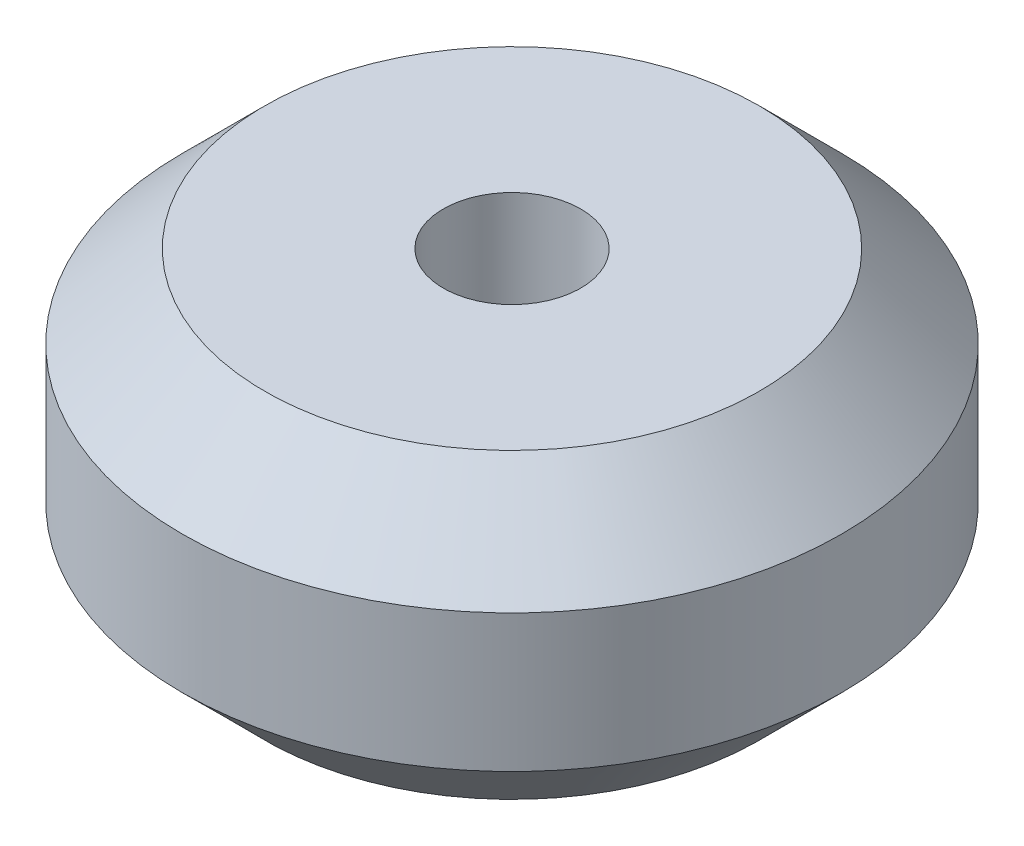
ISO-10303-21;
HEADER;
FILE_DESCRIPTION(('STEP AP214'),'2;1');
FILE_NAME('part.step','',(''),(''),'','','');
FILE_SCHEMA(('AUTOMOTIVE_DESIGN { 1 0 10303 214 1 1 1 1 }'));
ENDSEC;
DATA;
#1=APPLICATION_CONTEXT('core data for automotive mechanical design processes');
#2=APPLICATION_PROTOCOL_DEFINITION('international standard','automotive_design',2000,#1);
#3=PRODUCT_CONTEXT('',#1,'mechanical');
#4=PRODUCT('Part','Part','',(#3));
#5=PRODUCT_RELATED_PRODUCT_CATEGORY('part','',(#4));
#6=PRODUCT_DEFINITION_FORMATION('','',#4);
#7=PRODUCT_DEFINITION_CONTEXT('part definition',#1,'design');
#8=PRODUCT_DEFINITION('design','',#6,#7);
#9=PRODUCT_DEFINITION_SHAPE('','',#8);
#10=(LENGTH_UNIT() NAMED_UNIT(*) SI_UNIT(.MILLI.,.METRE.));
#11=(NAMED_UNIT(*) PLANE_ANGLE_UNIT() SI_UNIT($,.RADIAN.));
#12=(NAMED_UNIT(*) SI_UNIT($,.STERADIAN.) SOLID_ANGLE_UNIT());
#13=UNCERTAINTY_MEASURE_WITH_UNIT(LENGTH_MEASURE(1.E-05),#10,'distance_accuracy_value','');
#14=(GEOMETRIC_REPRESENTATION_CONTEXT(3) GLOBAL_UNCERTAINTY_ASSIGNED_CONTEXT((#13)) GLOBAL_UNIT_ASSIGNED_CONTEXT((#10,
#11,#12)) REPRESENTATION_CONTEXT('',''));
#15=CARTESIAN_POINT('',(0.,0.,0.));
#16=DIRECTION('',(0.,0.,1.));
#17=DIRECTION('',(1.,0.,0.));
#18=AXIS2_PLACEMENT_3D('',#15,#16,#17);
#19=CARTESIAN_POINT('',(0.,5.5,9.00000000000001));
#20=DIRECTION('',(0.,-1.,0.));
#21=DIRECTION('',(0.,0.,-1.));
#22=AXIS2_PLACEMENT_3D('',#19,#20,#21);
#23=PLANE('',#22);
#24=CARTESIAN_POINT('',(0.,5.5,0.));
#25=DIRECTION('',(0.,-1.,0.));
#26=DIRECTION('',(0.,0.,-1.));
#27=AXIS2_PLACEMENT_3D('',#24,#25,#26);
#28=CIRCLE('',#27,9.00000000000001);
#29=CARTESIAN_POINT('',(0.,5.5,-9.00000000000001));
#30=VERTEX_POINT('',#29);
#31=EDGE_CURVE('E57',#30,#30,#28,.T.);
#32=ORIENTED_EDGE('',*,*,#31,.F.);
#33=EDGE_LOOP('',(#32));
#34=FACE_BOUND('',#33,.T.);
#35=CARTESIAN_POINT('',(0.,5.5,0.));
#36=DIRECTION('',(0.,-1.,0.));
#37=DIRECTION('',(0.,0.,-1.));
#38=AXIS2_PLACEMENT_3D('',#35,#36,#37);
#39=CIRCLE('',#38,2.5);
#40=CARTESIAN_POINT('',(0.,5.5,-2.5));
#41=VERTEX_POINT('',#40);
#42=EDGE_CURVE('E10',#41,#41,#39,.T.);
#43=ORIENTED_EDGE('',*,*,#42,.T.);
#44=EDGE_LOOP('',(#43));
#45=FACE_BOUND('',#44,.T.);
#46=ADVANCED_FACE('F35',(#34,#45),#23,.F.);
#47=CARTESIAN_POINT('',(0.,0.,0.));
#48=DIRECTION('',(0.,-1.,0.));
#49=DIRECTION('',(0.,0.,-1.));
#50=AXIS2_PLACEMENT_3D('',#47,#48,#49);
#51=CYLINDRICAL_SURFACE('',#50,2.5);
#52=ORIENTED_EDGE('',*,*,#42,.F.);
#53=EDGE_LOOP('',(#52));
#54=FACE_BOUND('',#53,.T.);
#55=CARTESIAN_POINT('',(0.,-5.5,0.));
#56=DIRECTION('',(0.,-1.,0.));
#57=DIRECTION('',(0.,0.,-1.));
#58=AXIS2_PLACEMENT_3D('',#55,#56,#57);
#59=CIRCLE('',#58,2.5);
#60=CARTESIAN_POINT('',(0.,-5.5,-2.5));
#61=VERTEX_POINT('',#60);
#62=EDGE_CURVE('E41',#61,#61,#59,.T.);
#63=ORIENTED_EDGE('',*,*,#62,.T.);
#64=EDGE_LOOP('',(#63));
#65=FACE_BOUND('',#64,.T.);
#66=ADVANCED_FACE('F64',(#54,#65),#51,.F.);
#67=CARTESIAN_POINT('',(0.,-5.5,9.00000000000001));
#68=DIRECTION('',(0.,1.,0.));
#69=DIRECTION('',(0.,0.,1.));
#70=AXIS2_PLACEMENT_3D('',#67,#68,#69);
#71=PLANE('',#70);
#72=ORIENTED_EDGE('',*,*,#62,.F.);
#73=EDGE_LOOP('',(#72));
#74=FACE_BOUND('',#73,.T.);
#75=CARTESIAN_POINT('',(0.,-5.5,0.));
#76=DIRECTION('',(0.,-1.,0.));
#77=DIRECTION('',(0.,0.,-1.));
#78=AXIS2_PLACEMENT_3D('',#75,#76,#77);
#79=CIRCLE('',#78,9.00000000000001);
#80=CARTESIAN_POINT('',(0.,-5.5,-9.00000000000001));
#81=VERTEX_POINT('',#80);
#82=EDGE_CURVE('E45',#81,#81,#79,.T.);
#83=ORIENTED_EDGE('',*,*,#82,.T.);
#84=EDGE_LOOP('',(#83));
#85=FACE_BOUND('',#84,.T.);
#86=ADVANCED_FACE('F68',(#74,#85),#71,.F.);
#87=CARTESIAN_POINT('',(0.,-2.5,0.));
#88=DIRECTION('',(0.,1.,0.));
#89=DIRECTION('',(0.,0.,1.));
#90=AXIS2_PLACEMENT_3D('',#87,#88,#89);
#91=CONICAL_SURFACE('',#90,12.,0.785398163397447);
#92=ORIENTED_EDGE('',*,*,#82,.F.);
#93=EDGE_LOOP('',(#92));
#94=FACE_BOUND('',#93,.T.);
#95=CARTESIAN_POINT('',(0.,-2.5,0.));
#96=DIRECTION('',(0.,-1.,0.));
#97=DIRECTION('',(0.,0.,-1.));
#98=AXIS2_PLACEMENT_3D('',#95,#96,#97);
#99=CIRCLE('',#98,12.);
#100=CARTESIAN_POINT('',(0.,-2.5,-12.));
#101=VERTEX_POINT('',#100);
#102=EDGE_CURVE('E49',#101,#101,#99,.T.);
#103=ORIENTED_EDGE('',*,*,#102,.T.);
#104=EDGE_LOOP('',(#103));
#105=FACE_BOUND('',#104,.T.);
#106=ADVANCED_FACE('F73',(#94,#105),#91,.T.);
#107=CARTESIAN_POINT('',(0.,0.,0.));
#108=DIRECTION('',(0.,-1.,0.));
#109=DIRECTION('',(0.,0.,-1.));
#110=AXIS2_PLACEMENT_3D('',#107,#108,#109);
#111=CYLINDRICAL_SURFACE('',#110,12.);
#112=ORIENTED_EDGE('',*,*,#102,.F.);
#113=EDGE_LOOP('',(#112));
#114=FACE_BOUND('',#113,.T.);
#115=CARTESIAN_POINT('',(0.,2.5,0.));
#116=DIRECTION('',(0.,-1.,0.));
#117=DIRECTION('',(0.,0.,-1.));
#118=AXIS2_PLACEMENT_3D('',#115,#116,#117);
#119=CIRCLE('',#118,12.);
#120=CARTESIAN_POINT('',(0.,2.5,-12.));
#121=VERTEX_POINT('',#120);
#122=EDGE_CURVE('E54',#121,#121,#119,.T.);
#123=ORIENTED_EDGE('',*,*,#122,.T.);
#124=EDGE_LOOP('',(#123));
#125=FACE_BOUND('',#124,.T.);
#126=ADVANCED_FACE('F79',(#114,#125),#111,.T.);
#127=CARTESIAN_POINT('',(0.,5.5,0.));
#128=DIRECTION('',(0.,-1.,0.));
#129=DIRECTION('',(0.,0.,-1.));
#130=AXIS2_PLACEMENT_3D('',#127,#128,#129);
#131=CONICAL_SURFACE('',#130,9.00000000000001,0.785398163397446);
#132=ORIENTED_EDGE('',*,*,#122,.F.);
#133=EDGE_LOOP('',(#132));
#134=FACE_BOUND('',#133,.T.);
#135=ORIENTED_EDGE('',*,*,#31,.T.);
#136=EDGE_LOOP('',(#135));
#137=FACE_BOUND('',#136,.T.);
#138=ADVANCED_FACE('F61',(#134,#137),#131,.T.);
#139=CLOSED_SHELL('',(#46,#66,#86,#106,#126,#138));
#140=MANIFOLD_SOLID_BREP('B2',#139);
#141=ADVANCED_BREP_SHAPE_REPRESENTATION('',(#18,#140),#14);
#142=SHAPE_DEFINITION_REPRESENTATION(#9,#141);
ENDSEC;
END-ISO-10303-21;
